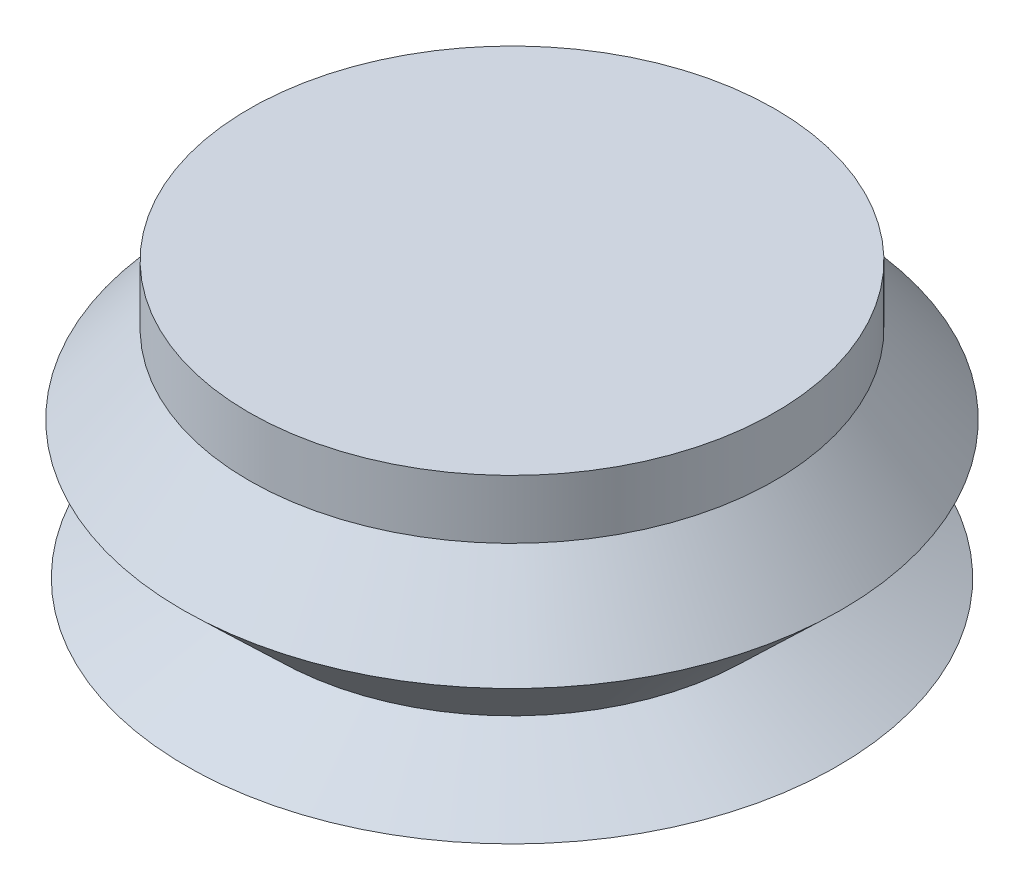
ISO-10303-21;
HEADER;
FILE_DESCRIPTION(('STEP AP214'),'2;1');
FILE_NAME('part.step','',(''),(''),'','','');
FILE_SCHEMA(('AUTOMOTIVE_DESIGN { 1 0 10303 214 1 1 1 1 }'));
ENDSEC;
DATA;
#1=APPLICATION_CONTEXT('core data for automotive mechanical design processes');
#2=APPLICATION_PROTOCOL_DEFINITION('international standard','automotive_design',2000,#1);
#3=PRODUCT_CONTEXT('',#1,'mechanical');
#4=PRODUCT('Part','Part','',(#3));
#5=PRODUCT_RELATED_PRODUCT_CATEGORY('part','',(#4));
#6=PRODUCT_DEFINITION_FORMATION('','',#4);
#7=PRODUCT_DEFINITION_CONTEXT('part definition',#1,'design');
#8=PRODUCT_DEFINITION('design','',#6,#7);
#9=PRODUCT_DEFINITION_SHAPE('','',#8);
#10=(LENGTH_UNIT() NAMED_UNIT(*) SI_UNIT(.MILLI.,.METRE.));
#11=(NAMED_UNIT(*) PLANE_ANGLE_UNIT() SI_UNIT($,.RADIAN.));
#12=(NAMED_UNIT(*) SI_UNIT($,.STERADIAN.) SOLID_ANGLE_UNIT());
#13=UNCERTAINTY_MEASURE_WITH_UNIT(LENGTH_MEASURE(1.E-05),#10,'distance_accuracy_value','');
#14=(GEOMETRIC_REPRESENTATION_CONTEXT(3) GLOBAL_UNCERTAINTY_ASSIGNED_CONTEXT((#13)) GLOBAL_UNIT_ASSIGNED_CONTEXT((#10,
#11,#12)) REPRESENTATION_CONTEXT('',''));
#15=CARTESIAN_POINT('',(0.,0.,0.));
#16=DIRECTION('',(0.,0.,1.));
#17=DIRECTION('',(1.,0.,0.));
#18=AXIS2_PLACEMENT_3D('',#15,#16,#17);
#19=CARTESIAN_POINT('',(0.,0.,0.));
#20=DIRECTION('',(0.,-1.,0.));
#21=DIRECTION('',(0.,0.,-1.));
#22=AXIS2_PLACEMENT_3D('',#19,#20,#21);
#23=PLANE('',#22);
#24=CARTESIAN_POINT('',(0.,0.,0.));
#25=DIRECTION('',(0.,-1.,0.));
#26=DIRECTION('',(0.,0.,-1.));
#27=AXIS2_PLACEMENT_3D('',#24,#25,#26);
#28=CIRCLE('',#27,41.5);
#29=CARTESIAN_POINT('',(0.,0.,-41.5));
#30=VERTEX_POINT('',#29);
#31=EDGE_CURVE('E10',#30,#30,#28,.T.);
#32=ORIENTED_EDGE('',*,*,#31,.T.);
#33=EDGE_LOOP('',(#32));
#34=FACE_BOUND('',#33,.T.);
#35=ADVANCED_FACE('F38',(#34),#23,.T.);
#36=CARTESIAN_POINT('',(0.,0.,0.));
#37=DIRECTION('',(0.,-1.,0.));
#38=DIRECTION('',(0.,0.,-1.));
#39=AXIS2_PLACEMENT_3D('',#36,#37,#38);
#40=CONICAL_SURFACE('',#39,41.5,1.08990904659956);
#41=CARTESIAN_POINT('',(0.,6.,0.));
#42=DIRECTION('',(0.,-1.,0.));
#43=DIRECTION('',(0.,0.,-1.));
#44=AXIS2_PLACEMENT_3D('',#41,#42,#43);
#45=CIRCLE('',#44,30.);
#46=CARTESIAN_POINT('',(0.,6.,-30.));
#47=VERTEX_POINT('',#46);
#48=EDGE_CURVE('E44',#47,#47,#45,.T.);
#49=ORIENTED_EDGE('',*,*,#48,.T.);
#50=EDGE_LOOP('',(#49));
#51=FACE_BOUND('',#50,.T.);
#52=ORIENTED_EDGE('',*,*,#31,.F.);
#53=EDGE_LOOP('',(#52));
#54=FACE_BOUND('',#53,.T.);
#55=ADVANCED_FACE('F73',(#51,#54),#40,.T.);
#56=CARTESIAN_POINT('',(0.,6.,0.));
#57=DIRECTION('',(0.,1.,0.));
#58=DIRECTION('',(0.,0.,1.));
#59=AXIS2_PLACEMENT_3D('',#56,#57,#58);
#60=CONICAL_SURFACE('',#59,30.,0.80667154942151);
#61=CARTESIAN_POINT('',(0.,17.5,0.));
#62=DIRECTION('',(0.,-1.,0.));
#63=DIRECTION('',(0.,0.,-1.));
#64=AXIS2_PLACEMENT_3D('',#61,#62,#63);
#65=CIRCLE('',#64,42.);
#66=CARTESIAN_POINT('',(0.,17.5,-42.));
#67=VERTEX_POINT('',#66);
#68=EDGE_CURVE('E48',#67,#67,#65,.T.);
#69=ORIENTED_EDGE('',*,*,#68,.T.);
#70=EDGE_LOOP('',(#69));
#71=FACE_BOUND('',#70,.T.);
#72=ORIENTED_EDGE('',*,*,#48,.F.);
#73=EDGE_LOOP('',(#72));
#74=FACE_BOUND('',#73,.T.);
#75=ADVANCED_FACE('F77',(#71,#74),#60,.T.);
#76=CARTESIAN_POINT('',(0.,17.5,0.));
#77=DIRECTION('',(0.,-1.,0.));
#78=DIRECTION('',(0.,0.,-1.));
#79=AXIS2_PLACEMENT_3D('',#76,#77,#78);
#80=CONICAL_SURFACE('',#79,42.,0.704494064242218);
#81=CARTESIAN_POINT('',(0.,27.5,0.));
#82=DIRECTION('',(0.,-1.,0.));
#83=DIRECTION('',(0.,0.,-1.));
#84=AXIS2_PLACEMENT_3D('',#81,#82,#83);
#85=CIRCLE('',#84,33.5);
#86=CARTESIAN_POINT('',(0.,27.5,-33.5));
#87=VERTEX_POINT('',#86);
#88=EDGE_CURVE('E52',#87,#87,#85,.T.);
#89=ORIENTED_EDGE('',*,*,#88,.T.);
#90=EDGE_LOOP('',(#89));
#91=FACE_BOUND('',#90,.T.);
#92=ORIENTED_EDGE('',*,*,#68,.F.);
#93=EDGE_LOOP('',(#92));
#94=FACE_BOUND('',#93,.T.);
#95=ADVANCED_FACE('F70',(#91,#94),#80,.T.);
#96=CARTESIAN_POINT('',(0.,0.,0.));
#97=DIRECTION('',(0.,-1.,0.));
#98=DIRECTION('',(0.,0.,-1.));
#99=AXIS2_PLACEMENT_3D('',#96,#97,#98);
#100=CYLINDRICAL_SURFACE('',#99,33.5);
#101=CARTESIAN_POINT('',(0.,35.,0.));
#102=DIRECTION('',(0.,-1.,0.));
#103=DIRECTION('',(0.,0.,-1.));
#104=AXIS2_PLACEMENT_3D('',#101,#102,#103);
#105=CIRCLE('',#104,33.5);
#106=CARTESIAN_POINT('',(0.,35.,-33.5));
#107=VERTEX_POINT('',#106);
#108=EDGE_CURVE('E57',#107,#107,#105,.T.);
#109=ORIENTED_EDGE('',*,*,#108,.T.);
#110=EDGE_LOOP('',(#109));
#111=FACE_BOUND('',#110,.T.);
#112=ORIENTED_EDGE('',*,*,#88,.F.);
#113=EDGE_LOOP('',(#112));
#114=FACE_BOUND('',#113,.T.);
#115=ADVANCED_FACE('F61',(#111,#114),#100,.T.);
#116=CARTESIAN_POINT('',(33.5,35.,0.));
#117=DIRECTION('',(0.,1.,0.));
#118=DIRECTION('',(0.,0.,1.));
#119=AXIS2_PLACEMENT_3D('',#116,#117,#118);
#120=PLANE('',#119);
#121=ORIENTED_EDGE('',*,*,#108,.F.);
#122=EDGE_LOOP('',(#121));
#123=FACE_BOUND('',#122,.T.);
#124=ADVANCED_FACE('F64',(#123),#120,.T.);
#125=CLOSED_SHELL('',(#35,#55,#75,#95,#115,#124));
#126=MANIFOLD_SOLID_BREP('B2',#125);
#127=ADVANCED_BREP_SHAPE_REPRESENTATION('',(#18,#126),#14);
#128=SHAPE_DEFINITION_REPRESENTATION(#9,#127);
ENDSEC;
END-ISO-10303-21;
